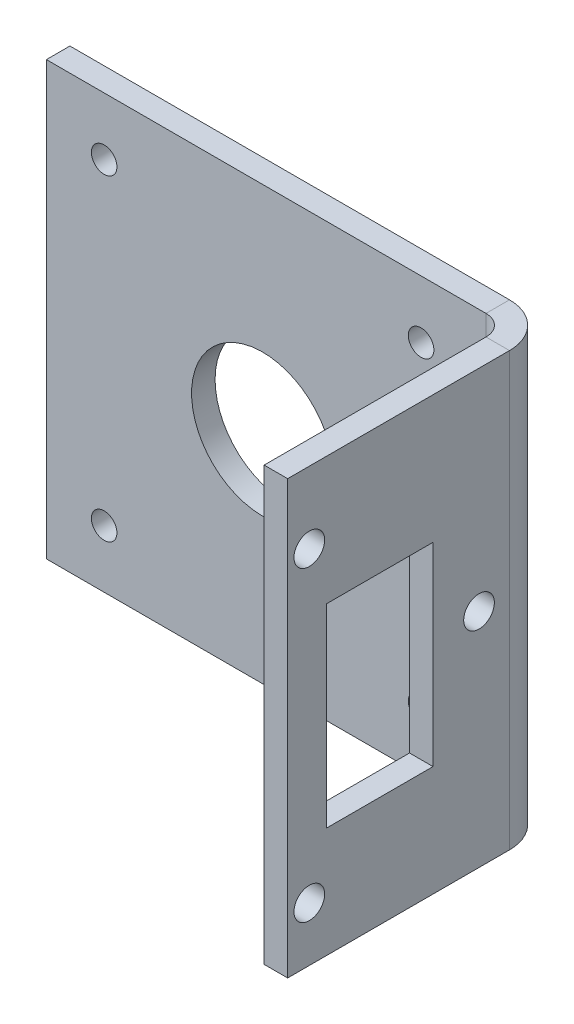
ISO-10303-21;
HEADER;
FILE_DESCRIPTION(('STEP AP214'),'2;1');
FILE_NAME('part.step','',(''),(''),'','','');
FILE_SCHEMA(('AUTOMOTIVE_DESIGN { 1 0 10303 214 1 1 1 1 }'));
ENDSEC;
DATA;
#1=APPLICATION_CONTEXT('core data for automotive mechanical design processes');
#2=APPLICATION_PROTOCOL_DEFINITION('international standard','automotive_design',2000,#1);
#3=PRODUCT_CONTEXT('',#1,'mechanical');
#4=PRODUCT('Part','Part','',(#3));
#5=PRODUCT_RELATED_PRODUCT_CATEGORY('part','',(#4));
#6=PRODUCT_DEFINITION_FORMATION('','',#4);
#7=PRODUCT_DEFINITION_CONTEXT('part definition',#1,'design');
#8=PRODUCT_DEFINITION('design','',#6,#7);
#9=PRODUCT_DEFINITION_SHAPE('','',#8);
#10=(LENGTH_UNIT() NAMED_UNIT(*) SI_UNIT(.MILLI.,.METRE.));
#11=(NAMED_UNIT(*) PLANE_ANGLE_UNIT() SI_UNIT($,.RADIAN.));
#12=(NAMED_UNIT(*) SI_UNIT($,.STERADIAN.) SOLID_ANGLE_UNIT());
#13=UNCERTAINTY_MEASURE_WITH_UNIT(LENGTH_MEASURE(1.E-05),#10,'distance_accuracy_value','');
#14=(GEOMETRIC_REPRESENTATION_CONTEXT(3) GLOBAL_UNCERTAINTY_ASSIGNED_CONTEXT((#13)) GLOBAL_UNIT_ASSIGNED_CONTEXT((#10,
#11,#12)) REPRESENTATION_CONTEXT('',''));
#15=CARTESIAN_POINT('',(0.,0.,0.));
#16=DIRECTION('',(0.,0.,1.));
#17=DIRECTION('',(1.,0.,0.));
#18=AXIS2_PLACEMENT_3D('',#15,#16,#17);
#19=CARTESIAN_POINT('',(0.,42.3,-2.3));
#20=DIRECTION('',(0.,1.,0.));
#21=DIRECTION('',(0.,0.,1.));
#22=AXIS2_PLACEMENT_3D('',#19,#20,#21);
#23=PLANE('',#22);
#24=DIRECTION('',(-1.,0.,0.));
#25=VECTOR('',#24,1.);
#26=CARTESIAN_POINT('',(0.,42.3,0.));
#27=LINE('',#26,#25);
#28=CARTESIAN_POINT('',(43.,42.3,0.));
#29=VERTEX_POINT('',#28);
#30=CARTESIAN_POINT('',(0.,42.3,0.));
#31=VERTEX_POINT('',#30);
#32=EDGE_CURVE('E242',#29,#31,#27,.T.);
#33=ORIENTED_EDGE('',*,*,#32,.F.);
#34=DIRECTION('',(0.,0.,-1.));
#35=VECTOR('',#34,1.);
#36=CARTESIAN_POINT('',(43.,42.3,0.));
#37=LINE('',#36,#35);
#38=CARTESIAN_POINT('',(43.,42.3,-2.3));
#39=VERTEX_POINT('',#38);
#40=EDGE_CURVE('E222',#29,#39,#37,.T.);
#41=ORIENTED_EDGE('',*,*,#40,.T.);
#42=DIRECTION('',(-1.,0.,0.));
#43=VECTOR('',#42,1.);
#44=CARTESIAN_POINT('',(0.,42.3,-2.3));
#45=LINE('',#44,#43);
#46=CARTESIAN_POINT('',(0.,42.3,-2.3));
#47=VERTEX_POINT('',#46);
#48=EDGE_CURVE('E245',#39,#47,#45,.T.);
#49=ORIENTED_EDGE('',*,*,#48,.T.);
#50=DIRECTION('',(0.,0.,1.));
#51=VECTOR('',#50,1.);
#52=CARTESIAN_POINT('',(0.,42.3,-2.3));
#53=LINE('',#52,#51);
#54=EDGE_CURVE('E254',#47,#31,#53,.T.);
#55=ORIENTED_EDGE('',*,*,#54,.T.);
#56=EDGE_LOOP('',(#33,#41,#49,#55));
#57=FACE_BOUND('',#56,.T.);
#58=ADVANCED_FACE('F63',(#57),#23,.T.);
#59=CARTESIAN_POINT('',(0.,0.,-2.3));
#60=DIRECTION('',(0.,0.,-1.));
#61=DIRECTION('',(-1.,0.,0.));
#62=AXIS2_PLACEMENT_3D('',#59,#60,#61);
#63=PLANE('',#62);
#64=CARTESIAN_POINT('',(21.1499999999973,21.1499999999938,-2.3));
#65=DIRECTION('',(0.,0.,-1.));
#66=DIRECTION('',(-1.,0.,0.));
#67=AXIS2_PLACEMENT_3D('',#64,#65,#66);
#68=CIRCLE('',#67,6.95000000000028);
#69=CARTESIAN_POINT('',(14.199999999997,21.1499999999938,-2.3));
#70=VERTEX_POINT('',#69);
#71=EDGE_CURVE('E306',#70,#70,#68,.T.);
#72=ORIENTED_EDGE('',*,*,#71,.F.);
#73=EDGE_LOOP('',(#72));
#74=FACE_BOUND('',#73,.T.);
#75=CARTESIAN_POINT('',(5.64999999999745,36.6499999999961,-2.3));
#76=DIRECTION('',(0.,0.,-1.));
#77=DIRECTION('',(-1.,0.,0.));
#78=AXIS2_PLACEMENT_3D('',#75,#76,#77);
#79=CIRCLE('',#78,1.2500000000003);
#80=CARTESIAN_POINT('',(4.39999999999715,36.6499999999961,-2.3));
#81=VERTEX_POINT('',#80);
#82=EDGE_CURVE('E278',#81,#81,#79,.T.);
#83=ORIENTED_EDGE('',*,*,#82,.F.);
#84=EDGE_LOOP('',(#83));
#85=FACE_BOUND('',#84,.T.);
#86=CARTESIAN_POINT('',(36.6499999999976,5.64999999999624,-2.3));
#87=DIRECTION('',(0.,0.,-1.));
#88=DIRECTION('',(-1.,0.,0.));
#89=AXIS2_PLACEMENT_3D('',#86,#87,#88);
#90=CIRCLE('',#89,1.2500000000003);
#91=CARTESIAN_POINT('',(35.3999999999973,5.64999999999624,-2.3));
#92=VERTEX_POINT('',#91);
#93=EDGE_CURVE('E285',#92,#92,#90,.T.);
#94=ORIENTED_EDGE('',*,*,#93,.F.);
#95=EDGE_LOOP('',(#94));
#96=FACE_BOUND('',#95,.T.);
#97=CARTESIAN_POINT('',(36.6499999999974,36.6499999999962,-2.3));
#98=DIRECTION('',(0.,0.,-1.));
#99=DIRECTION('',(-1.,0.,0.));
#100=AXIS2_PLACEMENT_3D('',#97,#98,#99);
#101=CIRCLE('',#100,1.2500000000003);
#102=CARTESIAN_POINT('',(35.3999999999972,36.6499999999962,-2.3));
#103=VERTEX_POINT('',#102);
#104=EDGE_CURVE('E288',#103,#103,#101,.T.);
#105=ORIENTED_EDGE('',*,*,#104,.F.);
#106=EDGE_LOOP('',(#105));
#107=FACE_BOUND('',#106,.T.);
#108=CARTESIAN_POINT('',(5.64999999999757,5.64999999999612,-2.3));
#109=DIRECTION('',(0.,0.,-1.));
#110=DIRECTION('',(-1.,0.,0.));
#111=AXIS2_PLACEMENT_3D('',#108,#109,#110);
#112=CIRCLE('',#111,1.2500000000003);
#113=CARTESIAN_POINT('',(4.39999999999728,5.64999999999612,-2.3));
#114=VERTEX_POINT('',#113);
#115=EDGE_CURVE('E291',#114,#114,#112,.T.);
#116=ORIENTED_EDGE('',*,*,#115,.F.);
#117=EDGE_LOOP('',(#116));
#118=FACE_BOUND('',#117,.T.);
#119=ORIENTED_EDGE('',*,*,#48,.F.);
#120=DIRECTION('',(0.,1.,0.));
#121=VECTOR('',#120,1.);
#122=CARTESIAN_POINT('',(43.,42.3,-2.3));
#123=LINE('',#122,#121);
#124=CARTESIAN_POINT('',(43.,0.,-2.3));
#125=VERTEX_POINT('',#124);
#126=EDGE_CURVE('E215',#39,#125,#123,.F.);
#127=ORIENTED_EDGE('',*,*,#126,.T.);
#128=DIRECTION('',(1.,0.,0.));
#129=VECTOR('',#128,1.);
#130=CARTESIAN_POINT('',(0.,0.,-2.3));
#131=LINE('',#130,#129);
#132=CARTESIAN_POINT('',(0.,0.,-2.3));
#133=VERTEX_POINT('',#132);
#134=EDGE_CURVE('E241',#133,#125,#131,.T.);
#135=ORIENTED_EDGE('',*,*,#134,.F.);
#136=DIRECTION('',(0.,-1.,0.));
#137=VECTOR('',#136,1.);
#138=CARTESIAN_POINT('',(0.,0.,-2.3));
#139=LINE('',#138,#137);
#140=EDGE_CURVE('E238',#47,#133,#139,.T.);
#141=ORIENTED_EDGE('',*,*,#140,.F.);
#142=EDGE_LOOP('',(#119,#127,#135,#141));
#143=FACE_BOUND('',#142,.T.);
#144=ADVANCED_FACE('F318',(#74,#85,#96,#107,#118,#143),#63,.T.);
#145=CARTESIAN_POINT('',(0.,0.,0.));
#146=DIRECTION('',(0.,0.,-1.));
#147=DIRECTION('',(-1.,0.,0.));
#148=AXIS2_PLACEMENT_3D('',#145,#146,#147);
#149=PLANE('',#148);
#150=CARTESIAN_POINT('',(21.1499999999973,21.1499999999938,0.));
#151=DIRECTION('',(0.,0.,1.));
#152=DIRECTION('',(1.,0.,0.));
#153=AXIS2_PLACEMENT_3D('',#150,#151,#152);
#154=CIRCLE('',#153,6.95000000000028);
#155=CARTESIAN_POINT('',(28.0999999999976,21.1499999999938,0.));
#156=VERTEX_POINT('',#155);
#157=EDGE_CURVE('E309',#156,#156,#154,.T.);
#158=ORIENTED_EDGE('',*,*,#157,.F.);
#159=EDGE_LOOP('',(#158));
#160=FACE_BOUND('',#159,.T.);
#161=CARTESIAN_POINT('',(5.64999999999745,36.6499999999961,0.));
#162=DIRECTION('',(0.,0.,1.));
#163=DIRECTION('',(1.,0.,0.));
#164=AXIS2_PLACEMENT_3D('',#161,#162,#163);
#165=CIRCLE('',#164,1.2500000000003);
#166=CARTESIAN_POINT('',(6.89999999999775,36.6499999999961,0.));
#167=VERTEX_POINT('',#166);
#168=EDGE_CURVE('E297',#167,#167,#165,.T.);
#169=ORIENTED_EDGE('',*,*,#168,.F.);
#170=EDGE_LOOP('',(#169));
#171=FACE_BOUND('',#170,.T.);
#172=CARTESIAN_POINT('',(36.6499999999976,5.64999999999624,0.));
#173=DIRECTION('',(0.,0.,1.));
#174=DIRECTION('',(1.,0.,0.));
#175=AXIS2_PLACEMENT_3D('',#172,#173,#174);
#176=CIRCLE('',#175,1.2500000000003);
#177=CARTESIAN_POINT('',(37.8999999999979,5.64999999999624,0.));
#178=VERTEX_POINT('',#177);
#179=EDGE_CURVE('E298',#178,#178,#176,.T.);
#180=ORIENTED_EDGE('',*,*,#179,.F.);
#181=EDGE_LOOP('',(#180));
#182=FACE_BOUND('',#181,.T.);
#183=CARTESIAN_POINT('',(36.6499999999974,36.6499999999962,0.));
#184=DIRECTION('',(0.,0.,1.));
#185=DIRECTION('',(1.,0.,0.));
#186=AXIS2_PLACEMENT_3D('',#183,#184,#185);
#187=CIRCLE('',#186,1.2500000000003);
#188=CARTESIAN_POINT('',(37.8999999999977,36.6499999999962,0.));
#189=VERTEX_POINT('',#188);
#190=EDGE_CURVE('E301',#189,#189,#187,.T.);
#191=ORIENTED_EDGE('',*,*,#190,.F.);
#192=EDGE_LOOP('',(#191));
#193=FACE_BOUND('',#192,.T.);
#194=CARTESIAN_POINT('',(5.64999999999757,5.64999999999612,0.));
#195=DIRECTION('',(0.,0.,1.));
#196=DIRECTION('',(1.,0.,0.));
#197=AXIS2_PLACEMENT_3D('',#194,#195,#196);
#198=CIRCLE('',#197,1.2500000000003);
#199=CARTESIAN_POINT('',(6.89999999999787,5.64999999999612,0.));
#200=VERTEX_POINT('',#199);
#201=EDGE_CURVE('E294',#200,#200,#198,.T.);
#202=ORIENTED_EDGE('',*,*,#201,.F.);
#203=EDGE_LOOP('',(#202));
#204=FACE_BOUND('',#203,.T.);
#205=DIRECTION('',(0.,1.,0.));
#206=VECTOR('',#205,1.);
#207=CARTESIAN_POINT('',(43.,42.3,0.));
#208=LINE('',#207,#206);
#209=CARTESIAN_POINT('',(43.,0.,0.));
#210=VERTEX_POINT('',#209);
#211=EDGE_CURVE('E228',#29,#210,#208,.F.);
#212=ORIENTED_EDGE('',*,*,#211,.F.);
#213=ORIENTED_EDGE('',*,*,#32,.T.);
#214=DIRECTION('',(0.,-1.,0.));
#215=VECTOR('',#214,1.);
#216=CARTESIAN_POINT('',(0.,0.,0.));
#217=LINE('',#216,#215);
#218=CARTESIAN_POINT('',(0.,0.,0.));
#219=VERTEX_POINT('',#218);
#220=EDGE_CURVE('E235',#31,#219,#217,.T.);
#221=ORIENTED_EDGE('',*,*,#220,.T.);
#222=DIRECTION('',(1.,0.,0.));
#223=VECTOR('',#222,1.);
#224=CARTESIAN_POINT('',(0.,0.,0.));
#225=LINE('',#224,#223);
#226=EDGE_CURVE('E250',#219,#210,#225,.T.);
#227=ORIENTED_EDGE('',*,*,#226,.T.);
#228=EDGE_LOOP('',(#212,#213,#221,#227));
#229=FACE_BOUND('',#228,.T.);
#230=ADVANCED_FACE('F315',(#160,#171,#182,#193,#204,#229),#149,.F.);
#231=CARTESIAN_POINT('',(0.,0.,-2.3));
#232=DIRECTION('',(-1.,0.,0.));
#233=DIRECTION('',(0.,0.,1.));
#234=AXIS2_PLACEMENT_3D('',#231,#232,#233);
#235=PLANE('',#234);
#236=ORIENTED_EDGE('',*,*,#220,.F.);
#237=ORIENTED_EDGE('',*,*,#54,.F.);
#238=ORIENTED_EDGE('',*,*,#140,.T.);
#239=DIRECTION('',(0.,0.,1.));
#240=VECTOR('',#239,1.);
#241=CARTESIAN_POINT('',(0.,0.,-2.3));
#242=LINE('',#241,#240);
#243=EDGE_CURVE('E247',#133,#219,#242,.T.);
#244=ORIENTED_EDGE('',*,*,#243,.T.);
#245=EDGE_LOOP('',(#236,#237,#238,#244));
#246=FACE_BOUND('',#245,.T.);
#247=ADVANCED_FACE('F65',(#246),#235,.T.);
#248=CARTESIAN_POINT('',(0.,0.,-2.3));
#249=DIRECTION('',(0.,-1.,0.));
#250=DIRECTION('',(0.,0.,-1.));
#251=AXIS2_PLACEMENT_3D('',#248,#249,#250);
#252=PLANE('',#251);
#253=DIRECTION('',(0.,0.,-1.));
#254=VECTOR('',#253,1.);
#255=CARTESIAN_POINT('',(43.,0.,0.));
#256=LINE('',#255,#254);
#257=EDGE_CURVE('E232',#210,#125,#256,.T.);
#258=ORIENTED_EDGE('',*,*,#257,.F.);
#259=ORIENTED_EDGE('',*,*,#226,.F.);
#260=ORIENTED_EDGE('',*,*,#243,.F.);
#261=ORIENTED_EDGE('',*,*,#134,.T.);
#262=EDGE_LOOP('',(#258,#259,#260,#261));
#263=FACE_BOUND('',#262,.T.);
#264=ADVANCED_FACE('F342',(#263),#252,.T.);
#265=CARTESIAN_POINT('',(43.,0.,2.));
#266=DIRECTION('',(0.,-1.,0.));
#267=DIRECTION('',(0.,0.,-1.));
#268=AXIS2_PLACEMENT_3D('',#265,#266,#267);
#269=PLANE('',#268);
#270=DIRECTION('',(1.,0.,0.));
#271=VECTOR('',#270,1.);
#272=CARTESIAN_POINT('',(47.3,0.,1.99999999999999));
#273=LINE('',#272,#271);
#274=CARTESIAN_POINT('',(45.,0.,1.99999999999999));
#275=VERTEX_POINT('',#274);
#276=CARTESIAN_POINT('',(47.3,0.,1.99999999999999));
#277=VERTEX_POINT('',#276);
#278=EDGE_CURVE('E180',#275,#277,#273,.T.);
#279=ORIENTED_EDGE('',*,*,#278,.F.);
#280=CARTESIAN_POINT('',(43.,0.,2.));
#281=DIRECTION('',(0.,1.,0.));
#282=DIRECTION('',(0.,0.,1.));
#283=AXIS2_PLACEMENT_3D('',#280,#281,#282);
#284=CIRCLE('',#283,2.);
#285=EDGE_CURVE('E225',#210,#275,#284,.F.);
#286=ORIENTED_EDGE('',*,*,#285,.F.);
#287=ORIENTED_EDGE('',*,*,#257,.T.);
#288=CARTESIAN_POINT('',(43.,0.,2.));
#289=DIRECTION('',(0.,1.,0.));
#290=DIRECTION('',(0.,0.,1.));
#291=AXIS2_PLACEMENT_3D('',#288,#289,#290);
#292=CIRCLE('',#291,4.3);
#293=EDGE_CURVE('E218',#125,#277,#292,.F.);
#294=ORIENTED_EDGE('',*,*,#293,.T.);
#295=EDGE_LOOP('',(#279,#286,#287,#294));
#296=FACE_BOUND('',#295,.T.);
#297=ADVANCED_FACE('F344',(#296),#269,.T.);
#298=CARTESIAN_POINT('',(43.,42.3,2.));
#299=DIRECTION('',(0.,-1.,0.));
#300=DIRECTION('',(0.,0.,-1.));
#301=AXIS2_PLACEMENT_3D('',#298,#299,#300);
#302=PLANE('',#301);
#303=CARTESIAN_POINT('',(43.,42.3,2.));
#304=DIRECTION('',(0.,1.,0.));
#305=DIRECTION('',(0.,0.,1.));
#306=AXIS2_PLACEMENT_3D('',#303,#304,#305);
#307=CIRCLE('',#306,2.);
#308=CARTESIAN_POINT('',(45.,42.3,1.99999999999999));
#309=VERTEX_POINT('',#308);
#310=EDGE_CURVE('E185',#309,#29,#307,.T.);
#311=ORIENTED_EDGE('',*,*,#310,.F.);
#312=DIRECTION('',(1.,0.,0.));
#313=VECTOR('',#312,1.);
#314=CARTESIAN_POINT('',(45.,42.3,1.99999999999999));
#315=LINE('',#314,#313);
#316=CARTESIAN_POINT('',(47.3,42.3,1.99999999999999));
#317=VERTEX_POINT('',#316);
#318=EDGE_CURVE('E208',#309,#317,#315,.T.);
#319=ORIENTED_EDGE('',*,*,#318,.T.);
#320=CARTESIAN_POINT('',(43.,42.3,2.));
#321=DIRECTION('',(0.,1.,0.));
#322=DIRECTION('',(0.,0.,1.));
#323=AXIS2_PLACEMENT_3D('',#320,#321,#322);
#324=CIRCLE('',#323,4.3);
#325=EDGE_CURVE('E219',#317,#39,#324,.T.);
#326=ORIENTED_EDGE('',*,*,#325,.T.);
#327=ORIENTED_EDGE('',*,*,#40,.F.);
#328=EDGE_LOOP('',(#311,#319,#326,#327));
#329=FACE_BOUND('',#328,.T.);
#330=ADVANCED_FACE('F350',(#329),#302,.F.);
#331=CARTESIAN_POINT('',(43.,42.3,2.));
#332=DIRECTION('',(0.,1.,0.));
#333=DIRECTION('',(1.,0.,0.));
#334=AXIS2_PLACEMENT_3D('',#331,#332,#333);
#335=CYLINDRICAL_SURFACE('',#334,4.3);
#336=ORIENTED_EDGE('',*,*,#126,.F.);
#337=ORIENTED_EDGE('',*,*,#325,.F.);
#338=DIRECTION('',(0.,1.,0.));
#339=VECTOR('',#338,1.);
#340=CARTESIAN_POINT('',(47.3,0.,1.99999999999999));
#341=LINE('',#340,#339);
#342=EDGE_CURVE('E205',#277,#317,#341,.T.);
#343=ORIENTED_EDGE('',*,*,#342,.F.);
#344=ORIENTED_EDGE('',*,*,#293,.F.);
#345=EDGE_LOOP('',(#336,#337,#343,#344));
#346=FACE_BOUND('',#345,.T.);
#347=ADVANCED_FACE('F347',(#346),#335,.T.);
#348=CARTESIAN_POINT('',(43.,42.3,2.));
#349=DIRECTION('',(0.,1.,0.));
#350=DIRECTION('',(1.,0.,0.));
#351=AXIS2_PLACEMENT_3D('',#348,#349,#350);
#352=CYLINDRICAL_SURFACE('',#351,2.);
#353=ORIENTED_EDGE('',*,*,#211,.T.);
#354=ORIENTED_EDGE('',*,*,#285,.T.);
#355=DIRECTION('',(0.,-1.,0.));
#356=VECTOR('',#355,1.);
#357=CARTESIAN_POINT('',(45.,0.,1.99999999999999));
#358=LINE('',#357,#356);
#359=EDGE_CURVE('E211',#275,#309,#358,.F.);
#360=ORIENTED_EDGE('',*,*,#359,.T.);
#361=ORIENTED_EDGE('',*,*,#310,.T.);
#362=EDGE_LOOP('',(#353,#354,#360,#361));
#363=FACE_BOUND('',#362,.T.);
#364=ADVANCED_FACE('F366',(#363),#352,.F.);
#365=CARTESIAN_POINT('',(47.3,42.3,0.));
#366=DIRECTION('',(0.,1.,0.));
#367=DIRECTION('',(0.,0.,1.));
#368=AXIS2_PLACEMENT_3D('',#365,#366,#367);
#369=PLANE('',#368);
#370=DIRECTION('',(0.,0.,-1.));
#371=VECTOR('',#370,1.);
#372=CARTESIAN_POINT('',(47.3,42.3,0.));
#373=LINE('',#372,#371);
#374=CARTESIAN_POINT('',(47.3000000000001,42.3,23.7));
#375=VERTEX_POINT('',#374);
#376=EDGE_CURVE('E189',#375,#317,#373,.T.);
#377=ORIENTED_EDGE('',*,*,#376,.T.);
#378=ORIENTED_EDGE('',*,*,#318,.F.);
#379=DIRECTION('',(0.,0.,1.));
#380=VECTOR('',#379,1.);
#381=CARTESIAN_POINT('',(45.,42.3,-1.66182117293576E-13));
#382=LINE('',#381,#380);
#383=CARTESIAN_POINT('',(45.0000000000001,42.3,23.7));
#384=VERTEX_POINT('',#383);
#385=EDGE_CURVE('E197',#384,#309,#382,.F.);
#386=ORIENTED_EDGE('',*,*,#385,.F.);
#387=DIRECTION('',(-1.,0.,0.));
#388=VECTOR('',#387,1.);
#389=CARTESIAN_POINT('',(47.3000000000001,42.3,23.7));
#390=LINE('',#389,#388);
#391=EDGE_CURVE('E183',#375,#384,#390,.T.);
#392=ORIENTED_EDGE('',*,*,#391,.F.);
#393=EDGE_LOOP('',(#377,#378,#386,#392));
#394=FACE_BOUND('',#393,.T.);
#395=ADVANCED_FACE('F357',(#394),#369,.T.);
#396=CARTESIAN_POINT('',(47.3000000000001,0.,23.7));
#397=DIRECTION('',(0.,-1.,0.));
#398=DIRECTION('',(0.,0.,-1.));
#399=AXIS2_PLACEMENT_3D('',#396,#397,#398);
#400=PLANE('',#399);
#401=DIRECTION('',(0.,0.,-1.));
#402=VECTOR('',#401,1.);
#403=CARTESIAN_POINT('',(45.,0.,-1.66182117293576E-13));
#404=LINE('',#403,#402);
#405=CARTESIAN_POINT('',(45.0000000000001,0.,23.7));
#406=VERTEX_POINT('',#405);
#407=EDGE_CURVE('E203',#275,#406,#404,.F.);
#408=ORIENTED_EDGE('',*,*,#407,.F.);
#409=ORIENTED_EDGE('',*,*,#278,.T.);
#410=DIRECTION('',(0.,0.,1.));
#411=VECTOR('',#410,1.);
#412=CARTESIAN_POINT('',(47.3000000000001,0.,23.7));
#413=LINE('',#412,#411);
#414=CARTESIAN_POINT('',(47.3000000000001,0.,23.7));
#415=VERTEX_POINT('',#414);
#416=EDGE_CURVE('E195',#277,#415,#413,.T.);
#417=ORIENTED_EDGE('',*,*,#416,.T.);
#418=DIRECTION('',(-1.,0.,0.));
#419=VECTOR('',#418,1.);
#420=CARTESIAN_POINT('',(47.3000000000001,0.,23.7));
#421=LINE('',#420,#419);
#422=EDGE_CURVE('E186',#415,#406,#421,.T.);
#423=ORIENTED_EDGE('',*,*,#422,.T.);
#424=EDGE_LOOP('',(#408,#409,#417,#423));
#425=FACE_BOUND('',#424,.T.);
#426=ADVANCED_FACE('F364',(#425),#400,.T.);
#427=CARTESIAN_POINT('',(47.3,0.,-1.74212524372915E-13));
#428=DIRECTION('',(1.,0.,0.));
#429=DIRECTION('',(0.,0.,-1.));
#430=AXIS2_PLACEMENT_3D('',#427,#428,#429);
#431=PLANE('',#430);
#432=CARTESIAN_POINT('',(47.3000000000001,35.3000000000001,21.5816180981396));
#433=DIRECTION('',(1.,0.,0.));
#434=DIRECTION('',(0.,0.,-1.));
#435=AXIS2_PLACEMENT_3D('',#432,#433,#434);
#436=CIRCLE('',#435,1.49999999999997);
#437=CARTESIAN_POINT('',(47.3000000000001,35.3000000000001,20.0816180981397));
#438=VERTEX_POINT('',#437);
#439=EDGE_CURVE('E266',#438,#438,#436,.T.);
#440=ORIENTED_EDGE('',*,*,#439,.F.);
#441=EDGE_LOOP('',(#440));
#442=FACE_BOUND('',#441,.T.);
#443=CARTESIAN_POINT('',(47.3,21.7000000000001,4.98161809813963));
#444=DIRECTION('',(1.,0.,0.));
#445=DIRECTION('',(0.,0.,-1.));
#446=AXIS2_PLACEMENT_3D('',#443,#444,#445);
#447=CIRCLE('',#446,1.50000000000008);
#448=CARTESIAN_POINT('',(47.3,21.7000000000001,3.48161809813955));
#449=VERTEX_POINT('',#448);
#450=EDGE_CURVE('E277',#449,#449,#447,.T.);
#451=ORIENTED_EDGE('',*,*,#450,.F.);
#452=EDGE_LOOP('',(#451));
#453=FACE_BOUND('',#452,.T.);
#454=CARTESIAN_POINT('',(47.3000000000001,5.30000000000008,21.5816180981396));
#455=DIRECTION('',(1.,0.,0.));
#456=DIRECTION('',(0.,0.,-1.));
#457=AXIS2_PLACEMENT_3D('',#454,#455,#456);
#458=CIRCLE('',#457,1.50000000000009);
#459=CARTESIAN_POINT('',(47.3000000000001,5.30000000000008,20.0816180981395));
#460=VERTEX_POINT('',#459);
#461=EDGE_CURVE('E274',#460,#460,#458,.T.);
#462=ORIENTED_EDGE('',*,*,#461,.F.);
#463=EDGE_LOOP('',(#462));
#464=FACE_BOUND('',#463,.T.);
#465=DIRECTION('',(0.,1.,0.));
#466=VECTOR('',#465,1.);
#467=CARTESIAN_POINT('',(47.3,29.8000000000001,9.48161809813969));
#468=LINE('',#467,#466);
#469=CARTESIAN_POINT('',(47.3,10.8000000000001,9.48161809813969));
#470=VERTEX_POINT('',#469);
#471=CARTESIAN_POINT('',(47.3,29.8000000000001,9.48161809813969));
#472=VERTEX_POINT('',#471);
#473=EDGE_CURVE('E80',#470,#472,#468,.T.);
#474=ORIENTED_EDGE('',*,*,#473,.F.);
#475=DIRECTION('',(0.,0.,-1.));
#476=VECTOR('',#475,1.);
#477=CARTESIAN_POINT('',(47.3,10.8000000000001,9.48161809813969));
#478=LINE('',#477,#476);
#479=CARTESIAN_POINT('',(47.3000000000001,10.8000000000001,19.8816180981397));
#480=VERTEX_POINT('',#479);
#481=EDGE_CURVE('E173',#480,#470,#478,.T.);
#482=ORIENTED_EDGE('',*,*,#481,.F.);
#483=DIRECTION('',(0.,-1.,0.));
#484=VECTOR('',#483,1.);
#485=CARTESIAN_POINT('',(47.3000000000001,29.8000000000001,19.8816180981397));
#486=LINE('',#485,#484);
#487=CARTESIAN_POINT('',(47.3000000000001,29.8000000000001,19.8816180981397));
#488=VERTEX_POINT('',#487);
#489=EDGE_CURVE('E157',#488,#480,#486,.T.);
#490=ORIENTED_EDGE('',*,*,#489,.F.);
#491=DIRECTION('',(0.,0.,1.));
#492=VECTOR('',#491,1.);
#493=CARTESIAN_POINT('',(47.3,29.8000000000001,9.48161809813969));
#494=LINE('',#493,#492);
#495=EDGE_CURVE('E166',#472,#488,#494,.T.);
#496=ORIENTED_EDGE('',*,*,#495,.F.);
#497=EDGE_LOOP('',(#474,#482,#490,#496));
#498=FACE_BOUND('',#497,.T.);
#499=ORIENTED_EDGE('',*,*,#416,.F.);
#500=ORIENTED_EDGE('',*,*,#342,.T.);
#501=ORIENTED_EDGE('',*,*,#376,.F.);
#502=DIRECTION('',(0.,1.,0.));
#503=VECTOR('',#502,1.);
#504=CARTESIAN_POINT('',(47.3000000000001,42.3,23.7));
#505=LINE('',#504,#503);
#506=EDGE_CURVE('E192',#415,#375,#505,.T.);
#507=ORIENTED_EDGE('',*,*,#506,.F.);
#508=EDGE_LOOP('',(#499,#500,#501,#507));
#509=FACE_BOUND('',#508,.T.);
#510=ADVANCED_FACE('F170',(#442,#453,#464,#498,#509),#431,.T.);
#511=CARTESIAN_POINT('',(45.,0.,-1.66182117293576E-13));
#512=DIRECTION('',(1.,0.,0.));
#513=DIRECTION('',(0.,0.,-1.));
#514=AXIS2_PLACEMENT_3D('',#511,#512,#513);
#515=PLANE('',#514);
#516=CARTESIAN_POINT('',(45.0000000000001,35.3000000000001,21.5816180981396));
#517=DIRECTION('',(1.,0.,0.));
#518=DIRECTION('',(0.,0.,-1.));
#519=AXIS2_PLACEMENT_3D('',#516,#517,#518);
#520=CIRCLE('',#519,1.49999999999997);
#521=CARTESIAN_POINT('',(45.0000000000001,35.3000000000001,20.0816180981397));
#522=VERTEX_POINT('',#521);
#523=EDGE_CURVE('E67',#522,#522,#520,.T.);
#524=ORIENTED_EDGE('',*,*,#523,.T.);
#525=EDGE_LOOP('',(#524));
#526=FACE_BOUND('',#525,.T.);
#527=CARTESIAN_POINT('',(45.,21.7000000000001,4.98161809813964));
#528=DIRECTION('',(1.,0.,0.));
#529=DIRECTION('',(0.,0.,-1.));
#530=AXIS2_PLACEMENT_3D('',#527,#528,#529);
#531=CIRCLE('',#530,1.50000000000008);
#532=CARTESIAN_POINT('',(45.,21.7000000000001,3.48161809813956));
#533=VERTEX_POINT('',#532);
#534=EDGE_CURVE('E265',#533,#533,#531,.T.);
#535=ORIENTED_EDGE('',*,*,#534,.T.);
#536=EDGE_LOOP('',(#535));
#537=FACE_BOUND('',#536,.T.);
#538=CARTESIAN_POINT('',(45.0000000000001,5.30000000000008,21.5816180981396));
#539=DIRECTION('',(1.,0.,0.));
#540=DIRECTION('',(0.,0.,-1.));
#541=AXIS2_PLACEMENT_3D('',#538,#539,#540);
#542=CIRCLE('',#541,1.50000000000009);
#543=CARTESIAN_POINT('',(45.0000000000001,5.30000000000008,20.0816180981396));
#544=VERTEX_POINT('',#543);
#545=EDGE_CURVE('E263',#544,#544,#542,.T.);
#546=ORIENTED_EDGE('',*,*,#545,.T.);
#547=EDGE_LOOP('',(#546));
#548=FACE_BOUND('',#547,.T.);
#549=DIRECTION('',(0.,0.,-1.));
#550=VECTOR('',#549,1.);
#551=CARTESIAN_POINT('',(45.,10.8000000000001,-1.66182117293576E-13));
#552=LINE('',#551,#550);
#553=CARTESIAN_POINT('',(45.0000000000001,10.8000000000001,19.8816180981397));
#554=VERTEX_POINT('',#553);
#555=CARTESIAN_POINT('',(45.0000000000001,10.8000000000001,9.4816180981397));
#556=VERTEX_POINT('',#555);
#557=EDGE_CURVE('E72',#554,#556,#552,.T.);
#558=ORIENTED_EDGE('',*,*,#557,.T.);
#559=DIRECTION('',(0.,1.,0.));
#560=VECTOR('',#559,1.);
#561=CARTESIAN_POINT('',(45.,0.,9.4816180981397));
#562=LINE('',#561,#560);
#563=CARTESIAN_POINT('',(45.0000000000001,29.8000000000001,9.4816180981397));
#564=VERTEX_POINT('',#563);
#565=EDGE_CURVE('E13',#556,#564,#562,.T.);
#566=ORIENTED_EDGE('',*,*,#565,.T.);
#567=DIRECTION('',(0.,0.,1.));
#568=VECTOR('',#567,1.);
#569=CARTESIAN_POINT('',(45.,29.8000000000001,-1.66182117293576E-13));
#570=LINE('',#569,#568);
#571=CARTESIAN_POINT('',(45.0000000000001,29.8000000000001,19.8816180981397));
#572=VERTEX_POINT('',#571);
#573=EDGE_CURVE('E257',#564,#572,#570,.T.);
#574=ORIENTED_EDGE('',*,*,#573,.T.);
#575=DIRECTION('',(0.,-1.,0.));
#576=VECTOR('',#575,1.);
#577=CARTESIAN_POINT('',(45.0000000000001,0.,19.8816180981397));
#578=LINE('',#577,#576);
#579=EDGE_CURVE('E160',#572,#554,#578,.T.);
#580=ORIENTED_EDGE('',*,*,#579,.T.);
#581=EDGE_LOOP('',(#558,#566,#574,#580));
#582=FACE_BOUND('',#581,.T.);
#583=ORIENTED_EDGE('',*,*,#359,.F.);
#584=ORIENTED_EDGE('',*,*,#407,.T.);
#585=DIRECTION('',(0.,-1.,0.));
#586=VECTOR('',#585,1.);
#587=CARTESIAN_POINT('',(45.0000000000001,0.,23.7));
#588=LINE('',#587,#586);
#589=EDGE_CURVE('E200',#406,#384,#588,.F.);
#590=ORIENTED_EDGE('',*,*,#589,.T.);
#591=ORIENTED_EDGE('',*,*,#385,.T.);
#592=EDGE_LOOP('',(#583,#584,#590,#591));
#593=FACE_BOUND('',#592,.T.);
#594=ADVANCED_FACE('F368',(#526,#537,#548,#582,#593),#515,.F.);
#595=CARTESIAN_POINT('',(47.3000000000001,42.3,23.7));
#596=DIRECTION('',(0.,0.,1.));
#597=DIRECTION('',(1.,0.,0.));
#598=AXIS2_PLACEMENT_3D('',#595,#596,#597);
#599=PLANE('',#598);
#600=ORIENTED_EDGE('',*,*,#589,.F.);
#601=ORIENTED_EDGE('',*,*,#422,.F.);
#602=ORIENTED_EDGE('',*,*,#506,.T.);
#603=ORIENTED_EDGE('',*,*,#391,.T.);
#604=EDGE_LOOP('',(#600,#601,#602,#603));
#605=FACE_BOUND('',#604,.T.);
#606=ADVANCED_FACE('F361',(#605),#599,.T.);
#607=CARTESIAN_POINT('',(44.3,29.8000000000001,9.4816180981397));
#608=DIRECTION('',(0.,0.,-1.));
#609=DIRECTION('',(-1.,0.,0.));
#610=AXIS2_PLACEMENT_3D('',#607,#608,#609);
#611=PLANE('',#610);
#612=DIRECTION('',(1.,0.,0.));
#613=VECTOR('',#612,1.);
#614=CARTESIAN_POINT('',(44.3,10.8000000000001,9.4816180981397));
#615=LINE('',#614,#613);
#616=EDGE_CURVE('E178',#556,#470,#615,.T.);
#617=ORIENTED_EDGE('',*,*,#616,.T.);
#618=ORIENTED_EDGE('',*,*,#473,.T.);
#619=DIRECTION('',(1.,0.,0.));
#620=VECTOR('',#619,1.);
#621=CARTESIAN_POINT('',(44.3,29.8000000000001,9.4816180981397));
#622=LINE('',#621,#620);
#623=EDGE_CURVE('E163',#564,#472,#622,.T.);
#624=ORIENTED_EDGE('',*,*,#623,.F.);
#625=ORIENTED_EDGE('',*,*,#565,.F.);
#626=EDGE_LOOP('',(#617,#618,#624,#625));
#627=FACE_BOUND('',#626,.T.);
#628=ADVANCED_FACE('F376',(#627),#611,.F.);
#629=CARTESIAN_POINT('',(44.3,10.8000000000001,9.4816180981397));
#630=DIRECTION('',(0.,-1.,0.));
#631=DIRECTION('',(0.,0.,-1.));
#632=AXIS2_PLACEMENT_3D('',#629,#630,#631);
#633=PLANE('',#632);
#634=DIRECTION('',(1.,0.,0.));
#635=VECTOR('',#634,1.);
#636=CARTESIAN_POINT('',(44.3000000000001,10.8000000000001,19.8816180981397));
#637=LINE('',#636,#635);
#638=EDGE_CURVE('E162',#554,#480,#637,.T.);
#639=ORIENTED_EDGE('',*,*,#638,.T.);
#640=ORIENTED_EDGE('',*,*,#481,.T.);
#641=ORIENTED_EDGE('',*,*,#616,.F.);
#642=ORIENTED_EDGE('',*,*,#557,.F.);
#643=EDGE_LOOP('',(#639,#640,#641,#642));
#644=FACE_BOUND('',#643,.T.);
#645=ADVANCED_FACE('F487',(#644),#633,.F.);
#646=CARTESIAN_POINT('',(44.3000000000001,29.8000000000001,19.8816180981397));
#647=DIRECTION('',(0.,0.,1.));
#648=DIRECTION('',(1.,0.,0.));
#649=AXIS2_PLACEMENT_3D('',#646,#647,#648);
#650=PLANE('',#649);
#651=DIRECTION('',(1.,0.,0.));
#652=VECTOR('',#651,1.);
#653=CARTESIAN_POINT('',(44.3000000000001,29.8000000000001,19.8816180981397));
#654=LINE('',#653,#652);
#655=EDGE_CURVE('E88',#572,#488,#654,.T.);
#656=ORIENTED_EDGE('',*,*,#655,.T.);
#657=ORIENTED_EDGE('',*,*,#489,.T.);
#658=ORIENTED_EDGE('',*,*,#638,.F.);
#659=ORIENTED_EDGE('',*,*,#579,.F.);
#660=EDGE_LOOP('',(#656,#657,#658,#659));
#661=FACE_BOUND('',#660,.T.);
#662=ADVANCED_FACE('F154',(#661),#650,.F.);
#663=CARTESIAN_POINT('',(44.3,29.8000000000001,9.4816180981397));
#664=DIRECTION('',(0.,1.,0.));
#665=DIRECTION('',(0.,0.,1.));
#666=AXIS2_PLACEMENT_3D('',#663,#664,#665);
#667=PLANE('',#666);
#668=ORIENTED_EDGE('',*,*,#623,.T.);
#669=ORIENTED_EDGE('',*,*,#495,.T.);
#670=ORIENTED_EDGE('',*,*,#655,.F.);
#671=ORIENTED_EDGE('',*,*,#573,.F.);
#672=EDGE_LOOP('',(#668,#669,#670,#671));
#673=FACE_BOUND('',#672,.T.);
#674=ADVANCED_FACE('F167',(#673),#667,.F.);
#675=CARTESIAN_POINT('',(44.3000000000001,5.30000000000008,21.5816180981396));
#676=DIRECTION('',(1.,0.,0.));
#677=DIRECTION('',(0.,0.,-1.));
#678=AXIS2_PLACEMENT_3D('',#675,#676,#677);
#679=CYLINDRICAL_SURFACE('',#678,1.50000000000009);
#680=ORIENTED_EDGE('',*,*,#461,.T.);
#681=EDGE_LOOP('',(#680));
#682=FACE_BOUND('',#681,.T.);
#683=ORIENTED_EDGE('',*,*,#545,.F.);
#684=EDGE_LOOP('',(#683));
#685=FACE_BOUND('',#684,.T.);
#686=ADVANCED_FACE('F512',(#682,#685),#679,.F.);
#687=CARTESIAN_POINT('',(44.3,21.7000000000001,4.98161809813964));
#688=DIRECTION('',(1.,0.,0.));
#689=DIRECTION('',(0.,0.,-1.));
#690=AXIS2_PLACEMENT_3D('',#687,#688,#689);
#691=CYLINDRICAL_SURFACE('',#690,1.50000000000008);
#692=ORIENTED_EDGE('',*,*,#450,.T.);
#693=EDGE_LOOP('',(#692));
#694=FACE_BOUND('',#693,.T.);
#695=ORIENTED_EDGE('',*,*,#534,.F.);
#696=EDGE_LOOP('',(#695));
#697=FACE_BOUND('',#696,.T.);
#698=ADVANCED_FACE('F520',(#694,#697),#691,.F.);
#699=CARTESIAN_POINT('',(44.3000000000001,35.3000000000001,21.5816180981396));
#700=DIRECTION('',(1.,0.,0.));
#701=DIRECTION('',(0.,0.,-1.));
#702=AXIS2_PLACEMENT_3D('',#699,#700,#701);
#703=CYLINDRICAL_SURFACE('',#702,1.49999999999997);
#704=ORIENTED_EDGE('',*,*,#439,.T.);
#705=EDGE_LOOP('',(#704));
#706=FACE_BOUND('',#705,.T.);
#707=ORIENTED_EDGE('',*,*,#523,.F.);
#708=EDGE_LOOP('',(#707));
#709=FACE_BOUND('',#708,.T.);
#710=ADVANCED_FACE('F530',(#706,#709),#703,.F.);
#711=CARTESIAN_POINT('',(5.64999999999757,5.64999999999612,-3.));
#712=DIRECTION('',(0.,0.,1.));
#713=DIRECTION('',(1.,0.,0.));
#714=AXIS2_PLACEMENT_3D('',#711,#712,#713);
#715=CYLINDRICAL_SURFACE('',#714,1.2500000000003);
#716=ORIENTED_EDGE('',*,*,#115,.T.);
#717=EDGE_LOOP('',(#716));
#718=FACE_BOUND('',#717,.T.);
#719=ORIENTED_EDGE('',*,*,#201,.T.);
#720=EDGE_LOOP('',(#719));
#721=FACE_BOUND('',#720,.T.);
#722=ADVANCED_FACE('F540',(#718,#721),#715,.F.);
#723=CARTESIAN_POINT('',(36.6499999999974,36.6499999999962,-3.));
#724=DIRECTION('',(0.,0.,1.));
#725=DIRECTION('',(1.,0.,0.));
#726=AXIS2_PLACEMENT_3D('',#723,#724,#725);
#727=CYLINDRICAL_SURFACE('',#726,1.2500000000003);
#728=ORIENTED_EDGE('',*,*,#104,.T.);
#729=EDGE_LOOP('',(#728));
#730=FACE_BOUND('',#729,.T.);
#731=ORIENTED_EDGE('',*,*,#190,.T.);
#732=EDGE_LOOP('',(#731));
#733=FACE_BOUND('',#732,.T.);
#734=ADVANCED_FACE('F550',(#730,#733),#727,.F.);
#735=CARTESIAN_POINT('',(36.6499999999976,5.64999999999624,-3.));
#736=DIRECTION('',(0.,0.,1.));
#737=DIRECTION('',(1.,0.,0.));
#738=AXIS2_PLACEMENT_3D('',#735,#736,#737);
#739=CYLINDRICAL_SURFACE('',#738,1.2500000000003);
#740=ORIENTED_EDGE('',*,*,#93,.T.);
#741=EDGE_LOOP('',(#740));
#742=FACE_BOUND('',#741,.T.);
#743=ORIENTED_EDGE('',*,*,#179,.T.);
#744=EDGE_LOOP('',(#743));
#745=FACE_BOUND('',#744,.T.);
#746=ADVANCED_FACE('F560',(#742,#745),#739,.F.);
#747=CARTESIAN_POINT('',(5.64999999999745,36.6499999999961,-3.));
#748=DIRECTION('',(0.,0.,1.));
#749=DIRECTION('',(1.,0.,0.));
#750=AXIS2_PLACEMENT_3D('',#747,#748,#749);
#751=CYLINDRICAL_SURFACE('',#750,1.2500000000003);
#752=ORIENTED_EDGE('',*,*,#82,.T.);
#753=EDGE_LOOP('',(#752));
#754=FACE_BOUND('',#753,.T.);
#755=ORIENTED_EDGE('',*,*,#168,.T.);
#756=EDGE_LOOP('',(#755));
#757=FACE_BOUND('',#756,.T.);
#758=ADVANCED_FACE('F571',(#754,#757),#751,.F.);
#759=CARTESIAN_POINT('',(21.1499999999973,21.1499999999938,-3.));
#760=DIRECTION('',(0.,0.,1.));
#761=DIRECTION('',(1.,0.,0.));
#762=AXIS2_PLACEMENT_3D('',#759,#760,#761);
#763=CYLINDRICAL_SURFACE('',#762,6.95000000000028);
#764=ORIENTED_EDGE('',*,*,#71,.T.);
#765=EDGE_LOOP('',(#764));
#766=FACE_BOUND('',#765,.T.);
#767=ORIENTED_EDGE('',*,*,#157,.T.);
#768=EDGE_LOOP('',(#767));
#769=FACE_BOUND('',#768,.T.);
#770=ADVANCED_FACE('F313',(#766,#769),#763,.F.);
#771=CLOSED_SHELL('',(#58,#144,#230,#247,#264,#297,#330,#347,#364,#395,#426,#510,#594,#606,#628,
#645,#662,#674,#686,#698,#710,#722,#734,#746,#758,#770));
#772=MANIFOLD_SOLID_BREP('B2',#771);
#773=ADVANCED_BREP_SHAPE_REPRESENTATION('',(#18,#772),#14);
#774=SHAPE_DEFINITION_REPRESENTATION(#9,#773);
ENDSEC;
END-ISO-10303-21;
